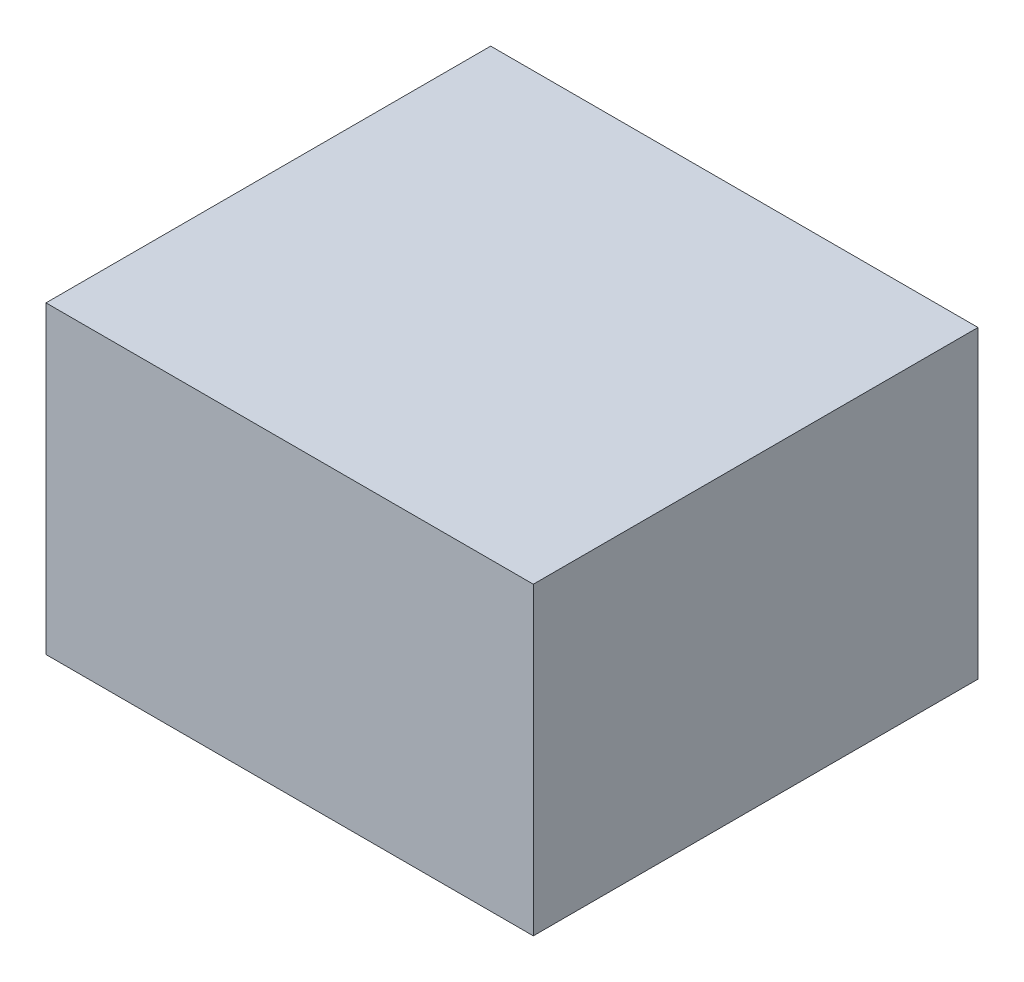
ISO-10303-21;
HEADER;
FILE_DESCRIPTION(('STEP AP214'),'2;1');
FILE_NAME('part.step','',(''),(''),'','','');
FILE_SCHEMA(('AUTOMOTIVE_DESIGN { 1 0 10303 214 1 1 1 1 }'));
ENDSEC;
DATA;
#1=APPLICATION_CONTEXT('core data for automotive mechanical design processes');
#2=APPLICATION_PROTOCOL_DEFINITION('international standard','automotive_design',2000,#1);
#3=PRODUCT_CONTEXT('',#1,'mechanical');
#4=PRODUCT('Part','Part','',(#3));
#5=PRODUCT_RELATED_PRODUCT_CATEGORY('part','',(#4));
#6=PRODUCT_DEFINITION_FORMATION('','',#4);
#7=PRODUCT_DEFINITION_CONTEXT('part definition',#1,'design');
#8=PRODUCT_DEFINITION('design','',#6,#7);
#9=PRODUCT_DEFINITION_SHAPE('','',#8);
#10=(LENGTH_UNIT() NAMED_UNIT(*) SI_UNIT(.MILLI.,.METRE.));
#11=(NAMED_UNIT(*) PLANE_ANGLE_UNIT() SI_UNIT($,.RADIAN.));
#12=(NAMED_UNIT(*) SI_UNIT($,.STERADIAN.) SOLID_ANGLE_UNIT());
#13=UNCERTAINTY_MEASURE_WITH_UNIT(LENGTH_MEASURE(1.E-05),#10,'distance_accuracy_value','');
#14=(GEOMETRIC_REPRESENTATION_CONTEXT(3) GLOBAL_UNCERTAINTY_ASSIGNED_CONTEXT((#13)) GLOBAL_UNIT_ASSIGNED_CONTEXT((#10,
#11,#12)) REPRESENTATION_CONTEXT('',''));
#15=CARTESIAN_POINT('',(0.,0.,0.));
#16=DIRECTION('',(0.,0.,1.));
#17=DIRECTION('',(1.,0.,0.));
#18=AXIS2_PLACEMENT_3D('',#15,#16,#17);
#19=CARTESIAN_POINT('',(-6.81818181818182,10.,-5.45454545454546));
#20=DIRECTION('',(1.,0.,0.));
#21=DIRECTION('',(0.,0.,-1.));
#22=AXIS2_PLACEMENT_3D('',#19,#20,#21);
#23=PLANE('',#22);
#24=DIRECTION('',(0.,0.,1.));
#25=VECTOR('',#24,1.);
#26=CARTESIAN_POINT('',(-6.81818181818182,0.,-5.45454545454546));
#27=LINE('',#26,#25);
#28=CARTESIAN_POINT('',(-6.81818181818182,0.,-5.45454545454546));
#29=VERTEX_POINT('',#28);
#30=CARTESIAN_POINT('',(-6.81818181818182,0.,9.14545454545454));
#31=VERTEX_POINT('',#30);
#32=EDGE_CURVE('E113',#29,#31,#27,.T.);
#33=ORIENTED_EDGE('',*,*,#32,.T.);
#34=DIRECTION('',(0.,-1.,0.));
#35=VECTOR('',#34,1.);
#36=CARTESIAN_POINT('',(-6.81818181818182,10.,9.14545454545454));
#37=LINE('',#36,#35);
#38=CARTESIAN_POINT('',(-6.81818181818182,10.,9.14545454545454));
#39=VERTEX_POINT('',#38);
#40=EDGE_CURVE('E11',#39,#31,#37,.T.);
#41=ORIENTED_EDGE('',*,*,#40,.F.);
#42=DIRECTION('',(0.,0.,1.));
#43=VECTOR('',#42,1.);
#44=CARTESIAN_POINT('',(-6.81818181818182,10.,-5.45454545454546));
#45=LINE('',#44,#43);
#46=CARTESIAN_POINT('',(-6.81818181818182,10.,-5.45454545454546));
#47=VERTEX_POINT('',#46);
#48=EDGE_CURVE('E97',#47,#39,#45,.T.);
#49=ORIENTED_EDGE('',*,*,#48,.F.);
#50=DIRECTION('',(0.,-1.,0.));
#51=VECTOR('',#50,1.);
#52=CARTESIAN_POINT('',(-6.81818181818182,10.,-5.45454545454546));
#53=LINE('',#52,#51);
#54=EDGE_CURVE('E109',#47,#29,#53,.T.);
#55=ORIENTED_EDGE('',*,*,#54,.T.);
#56=EDGE_LOOP('',(#33,#41,#49,#55));
#57=FACE_BOUND('',#56,.T.);
#58=ADVANCED_FACE('F45',(#57),#23,.F.);
#59=CARTESIAN_POINT('',(-6.81818181818182,10.,9.14545454545454));
#60=DIRECTION('',(0.,0.,-1.));
#61=DIRECTION('',(-1.,0.,0.));
#62=AXIS2_PLACEMENT_3D('',#59,#60,#61);
#63=PLANE('',#62);
#64=DIRECTION('',(1.,0.,0.));
#65=VECTOR('',#64,1.);
#66=CARTESIAN_POINT('',(-6.81818181818182,0.,9.14545454545454));
#67=LINE('',#66,#65);
#68=CARTESIAN_POINT('',(9.18181818181819,0.,9.14545454545454));
#69=VERTEX_POINT('',#68);
#70=EDGE_CURVE('E102',#31,#69,#67,.T.);
#71=ORIENTED_EDGE('',*,*,#70,.T.);
#72=DIRECTION('',(0.,-1.,0.));
#73=VECTOR('',#72,1.);
#74=CARTESIAN_POINT('',(9.18181818181819,10.,9.14545454545454));
#75=LINE('',#74,#73);
#76=CARTESIAN_POINT('',(9.18181818181819,10.,9.14545454545454));
#77=VERTEX_POINT('',#76);
#78=EDGE_CURVE('E54',#77,#69,#75,.T.);
#79=ORIENTED_EDGE('',*,*,#78,.F.);
#80=DIRECTION('',(1.,0.,0.));
#81=VECTOR('',#80,1.);
#82=CARTESIAN_POINT('',(-6.81818181818182,10.,9.14545454545454));
#83=LINE('',#82,#81);
#84=EDGE_CURVE('E92',#39,#77,#83,.T.);
#85=ORIENTED_EDGE('',*,*,#84,.F.);
#86=ORIENTED_EDGE('',*,*,#40,.T.);
#87=EDGE_LOOP('',(#71,#79,#85,#86));
#88=FACE_BOUND('',#87,.T.);
#89=ADVANCED_FACE('F101',(#88),#63,.F.);
#90=CARTESIAN_POINT('',(9.18181818181819,10.,-5.45454545454546));
#91=DIRECTION('',(-1.,0.,0.));
#92=DIRECTION('',(0.,0.,1.));
#93=AXIS2_PLACEMENT_3D('',#90,#91,#92);
#94=PLANE('',#93);
#95=DIRECTION('',(0.,0.,-1.));
#96=VECTOR('',#95,1.);
#97=CARTESIAN_POINT('',(9.18181818181819,0.,-5.45454545454546));
#98=LINE('',#97,#96);
#99=CARTESIAN_POINT('',(9.18181818181819,0.,-5.45454545454546));
#100=VERTEX_POINT('',#99);
#101=EDGE_CURVE('E79',#69,#100,#98,.T.);
#102=ORIENTED_EDGE('',*,*,#101,.T.);
#103=DIRECTION('',(0.,-1.,0.));
#104=VECTOR('',#103,1.);
#105=CARTESIAN_POINT('',(9.18181818181819,10.,-5.45454545454546));
#106=LINE('',#105,#104);
#107=CARTESIAN_POINT('',(9.18181818181819,10.,-5.45454545454546));
#108=VERTEX_POINT('',#107);
#109=EDGE_CURVE('E104',#108,#100,#106,.T.);
#110=ORIENTED_EDGE('',*,*,#109,.F.);
#111=DIRECTION('',(0.,0.,-1.));
#112=VECTOR('',#111,1.);
#113=CARTESIAN_POINT('',(9.18181818181819,10.,-5.45454545454546));
#114=LINE('',#113,#112);
#115=EDGE_CURVE('E95',#77,#108,#114,.T.);
#116=ORIENTED_EDGE('',*,*,#115,.F.);
#117=ORIENTED_EDGE('',*,*,#78,.T.);
#118=EDGE_LOOP('',(#102,#110,#116,#117));
#119=FACE_BOUND('',#118,.T.);
#120=ADVANCED_FACE('F105',(#119),#94,.F.);
#121=CARTESIAN_POINT('',(-6.81818181818182,10.,-5.45454545454546));
#122=DIRECTION('',(0.,0.,1.));
#123=DIRECTION('',(1.,0.,0.));
#124=AXIS2_PLACEMENT_3D('',#121,#122,#123);
#125=PLANE('',#124);
#126=DIRECTION('',(-1.,0.,0.));
#127=VECTOR('',#126,1.);
#128=CARTESIAN_POINT('',(-6.81818181818182,0.,-5.45454545454546));
#129=LINE('',#128,#127);
#130=EDGE_CURVE('E85',#100,#29,#129,.T.);
#131=ORIENTED_EDGE('',*,*,#130,.T.);
#132=ORIENTED_EDGE('',*,*,#54,.F.);
#133=DIRECTION('',(-1.,0.,0.));
#134=VECTOR('',#133,1.);
#135=CARTESIAN_POINT('',(-6.81818181818182,10.,-5.45454545454546));
#136=LINE('',#135,#134);
#137=EDGE_CURVE('E62',#108,#47,#136,.T.);
#138=ORIENTED_EDGE('',*,*,#137,.F.);
#139=ORIENTED_EDGE('',*,*,#109,.T.);
#140=EDGE_LOOP('',(#131,#132,#138,#139));
#141=FACE_BOUND('',#140,.T.);
#142=ADVANCED_FACE('F126',(#141),#125,.F.);
#143=CARTESIAN_POINT('',(0.,10.,0.));
#144=DIRECTION('',(0.,1.,0.));
#145=DIRECTION('',(0.,0.,1.));
#146=AXIS2_PLACEMENT_3D('',#143,#144,#145);
#147=PLANE('',#146);
#148=ORIENTED_EDGE('',*,*,#48,.T.);
#149=ORIENTED_EDGE('',*,*,#84,.T.);
#150=ORIENTED_EDGE('',*,*,#115,.T.);
#151=ORIENTED_EDGE('',*,*,#137,.T.);
#152=EDGE_LOOP('',(#148,#149,#150,#151));
#153=FACE_BOUND('',#152,.T.);
#154=ADVANCED_FACE('F93',(#153),#147,.T.);
#155=CARTESIAN_POINT('',(0.,0.,0.));
#156=DIRECTION('',(0.,1.,0.));
#157=DIRECTION('',(0.,0.,1.));
#158=AXIS2_PLACEMENT_3D('',#155,#156,#157);
#159=PLANE('',#158);
#160=ORIENTED_EDGE('',*,*,#32,.F.);
#161=ORIENTED_EDGE('',*,*,#130,.F.);
#162=ORIENTED_EDGE('',*,*,#101,.F.);
#163=ORIENTED_EDGE('',*,*,#70,.F.);
#164=EDGE_LOOP('',(#160,#161,#162,#163));
#165=FACE_BOUND('',#164,.T.);
#166=ADVANCED_FACE('F129',(#165),#159,.F.);
#167=CLOSED_SHELL('',(#58,#89,#120,#142,#154,#166));
#168=MANIFOLD_SOLID_BREP('B2',#167);
#169=ADVANCED_BREP_SHAPE_REPRESENTATION('',(#18,#168),#14);
#170=SHAPE_DEFINITION_REPRESENTATION(#9,#169);
ENDSEC;
END-ISO-10303-21;
